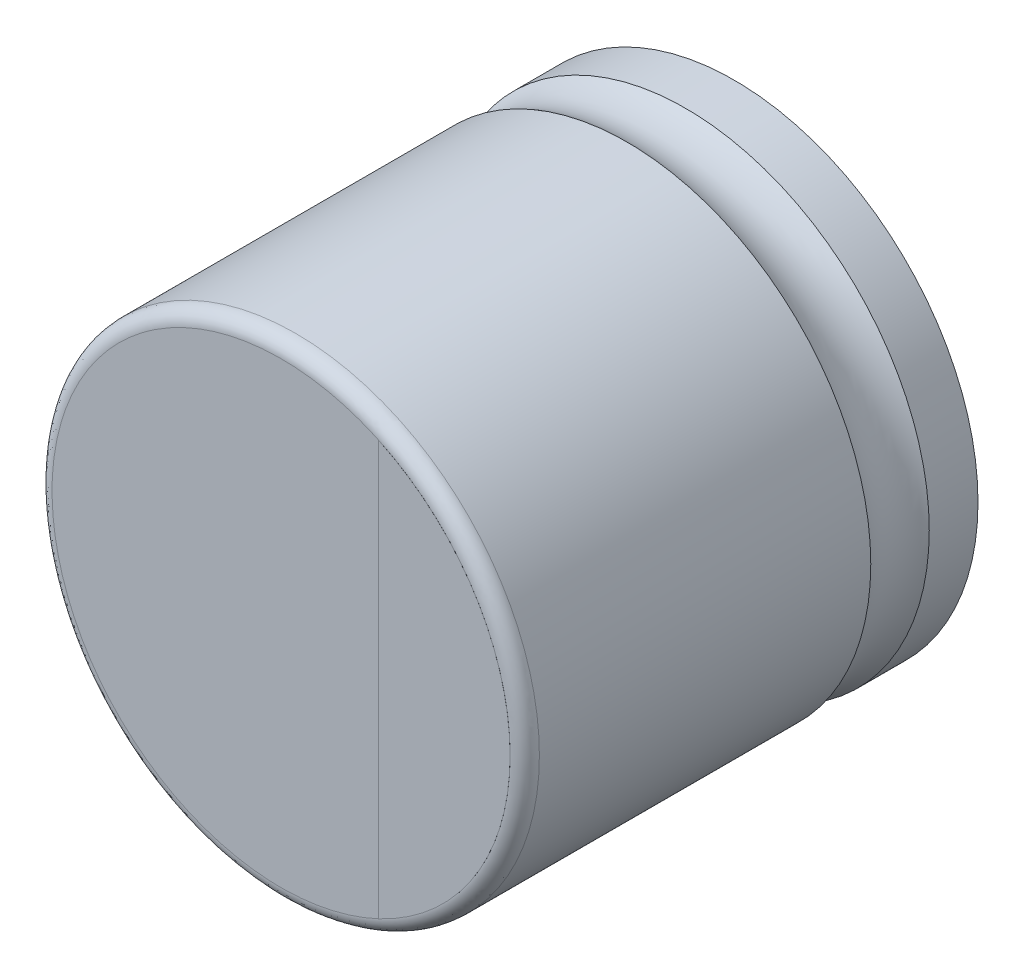
ISO-10303-21;
HEADER;
FILE_DESCRIPTION(('STEP AP214'),'2;1');
FILE_NAME('part.step','',(''),(''),'','','');
FILE_SCHEMA(('AUTOMOTIVE_DESIGN { 1 0 10303 214 1 1 1 1 }'));
ENDSEC;
DATA;
#1=APPLICATION_CONTEXT('core data for automotive mechanical design processes');
#2=APPLICATION_PROTOCOL_DEFINITION('international standard','automotive_design',2000,#1);
#3=PRODUCT_CONTEXT('',#1,'mechanical');
#4=PRODUCT('Part','Part','',(#3));
#5=PRODUCT_RELATED_PRODUCT_CATEGORY('part','',(#4));
#6=PRODUCT_DEFINITION_FORMATION('','',#4);
#7=PRODUCT_DEFINITION_CONTEXT('part definition',#1,'design');
#8=PRODUCT_DEFINITION('design','',#6,#7);
#9=PRODUCT_DEFINITION_SHAPE('','',#8);
#10=(LENGTH_UNIT() NAMED_UNIT(*) SI_UNIT(.MILLI.,.METRE.));
#11=(NAMED_UNIT(*) PLANE_ANGLE_UNIT() SI_UNIT($,.RADIAN.));
#12=(NAMED_UNIT(*) SI_UNIT($,.STERADIAN.) SOLID_ANGLE_UNIT());
#13=UNCERTAINTY_MEASURE_WITH_UNIT(LENGTH_MEASURE(1.E-05),#10,'distance_accuracy_value','');
#14=(GEOMETRIC_REPRESENTATION_CONTEXT(3) GLOBAL_UNCERTAINTY_ASSIGNED_CONTEXT((#13)) GLOBAL_UNIT_ASSIGNED_CONTEXT((#10,
#11,#12)) REPRESENTATION_CONTEXT('',''));
#15=CARTESIAN_POINT('',(0.,0.,0.));
#16=DIRECTION('',(0.,0.,1.));
#17=DIRECTION('',(1.,0.,0.));
#18=AXIS2_PLACEMENT_3D('',#15,#16,#17);
#19=CARTESIAN_POINT('',(0.,0.,5.75));
#20=DIRECTION('',(0.,0.,-1.));
#21=DIRECTION('',(1.,0.,0.));
#22=AXIS2_PLACEMENT_3D('',#19,#20,#21);
#23=CYLINDRICAL_SURFACE('',#22,5.);
#24=CARTESIAN_POINT('',(0.,0.,9.));
#25=DIRECTION('',(0.,0.,-1.));
#26=DIRECTION('',(1.,0.,0.));
#27=AXIS2_PLACEMENT_3D('',#24,#25,#26);
#28=CIRCLE('',#27,5.);
#29=CARTESIAN_POINT('',(5.,1.01865282226E-13,9.));
#30=VERTEX_POINT('',#29);
#31=CARTESIAN_POINT('',(2.127659574468,4.524717088965,9.));
#32=VERTEX_POINT('',#31);
#33=EDGE_CURVE('E30',#30,#32,#28,.T.);
#34=ORIENTED_EDGE('',*,*,#33,.T.);
#35=CARTESIAN_POINT('',(0.,0.,9.));
#36=DIRECTION('',(0.,0.,-1.));
#37=DIRECTION('',(1.,0.,0.));
#38=AXIS2_PLACEMENT_3D('',#35,#36,#37);
#39=CIRCLE('',#38,5.);
#40=EDGE_CURVE('E119',#32,#30,#39,.T.);
#41=ORIENTED_EDGE('',*,*,#40,.T.);
#42=CARTESIAN_POINT('',(5.,1.012529588265E-13,9.));
#43=CARTESIAN_POINT('',(5.,0.,2.2));
#44=(BOUNDED_CURVE() B_SPLINE_CURVE(1,(#42,#43),.UNSPECIFIED.,.F.,
.F.) B_SPLINE_CURVE_WITH_KNOTS((2,2),(-3.25,3.55),
.UNSPECIFIED.) CURVE() GEOMETRIC_REPRESENTATION_ITEM() RATIONAL_B_SPLINE_CURVE((1.,1.)) REPRESENTATION_ITEM(''));
#45=CARTESIAN_POINT('',(5.,0.,2.2));
#46=VERTEX_POINT('',#45);
#47=EDGE_CURVE('E11',#30,#46,#44,.T.);
#48=ORIENTED_EDGE('',*,*,#47,.T.);
#49=CARTESIAN_POINT('',(0.,0.,2.2));
#50=DIRECTION('',(0.,0.,1.));
#51=DIRECTION('',(1.,0.,0.));
#52=AXIS2_PLACEMENT_3D('',#49,#50,#51);
#53=CIRCLE('',#52,5.);
#54=EDGE_CURVE('E117',#46,#46,#53,.T.);
#55=ORIENTED_EDGE('',*,*,#54,.T.);
#56=ORIENTED_EDGE('',*,*,#47,.F.);
#57=EDGE_LOOP('',(#34,#41,#48,#55,#56));
#58=FACE_BOUND('',#57,.T.);
#59=ADVANCED_FACE('F17',(#58),#23,.T.);
#60=CARTESIAN_POINT('',(0.,5.,9.));
#61=CARTESIAN_POINT('',(0.,5.,9.17713755206305));
#62=CARTESIAN_POINT('',(0.,4.87411788572196,9.30176261236709));
#63=CARTESIAN_POINT('',(0.,4.69698925432352,9.29998489197037));
#64=(BOUNDED_CURVE() B_SPLINE_CURVE(3,(#60,#61,#62,#63),.UNSPECIFIED.,.F.,
.F.) B_SPLINE_CURVE_WITH_KNOTS((4,4),(0.,1.),
.UNSPECIFIED.) CURVE() GEOMETRIC_REPRESENTATION_ITEM() RATIONAL_B_SPLINE_CURVE((1.,
0.802366424105878,0.802366424105878,1.)) REPRESENTATION_ITEM(''));
#65=CARTESIAN_POINT('',(0.,0.,9.));
#66=DIRECTION('',(0.,0.,1.));
#67=AXIS1_PLACEMENT('',#65,#66);
#68=SURFACE_OF_REVOLUTION('',#64,#67);
#69=ORIENTED_EDGE('',*,*,#40,.F.);
#70=CARTESIAN_POINT('',(2.127659574468,4.524717088965,9.));
#71=CARTESIAN_POINT('',(2.127659574468,4.524717088965,9.07853981634));
#72=CARTESIAN_POINT('',(2.117162423061,4.502393667998,9.157072950212));
#73=CARTESIAN_POINT('',(2.096151933997,4.457712404106,9.225957044892));
#74=CARTESIAN_POINT('',(2.066839553281,4.395376196035,9.275331694194));
#75=CARTESIAN_POINT('',(2.033421198442,4.324308153459,9.3));
#76=CARTESIAN_POINT('',(2.,4.253234063627,9.3));
#77=(BOUNDED_CURVE() B_SPLINE_CURVE(6,(#70,#71,#72,#73,#74,#75,#76),.UNSPECIFIED.,.F.,
.F.) B_SPLINE_CURVE_WITH_KNOTS((7,7),(6.28318530718,7.853981633974),
.UNSPECIFIED.) CURVE() GEOMETRIC_REPRESENTATION_ITEM() RATIONAL_B_SPLINE_CURVE((1.,1.,1.,1.,1.,
1.,1.)) REPRESENTATION_ITEM(''));
#78=CARTESIAN_POINT('',(2.,4.253234063627,9.3));
#79=VERTEX_POINT('',#78);
#80=EDGE_CURVE('E116',#32,#79,#77,.T.);
#81=ORIENTED_EDGE('',*,*,#80,.T.);
#82=CARTESIAN_POINT('',(0.,0.,9.3));
#83=DIRECTION('',(0.,0.,-1.));
#84=DIRECTION('',(0.,1.,0.));
#85=AXIS2_PLACEMENT_3D('',#82,#83,#84);
#86=CIRCLE('',#85,4.7);
#87=CARTESIAN_POINT('',(2.,-4.253234063627,9.3));
#88=VERTEX_POINT('',#87);
#89=EDGE_CURVE('E96',#79,#88,#86,.T.);
#90=ORIENTED_EDGE('',*,*,#89,.T.);
#91=CARTESIAN_POINT('',(2.,-4.253234063627,9.3));
#92=CARTESIAN_POINT('',(1.483540679413,-4.496088941991,9.3));
#93=CARTESIAN_POINT('',(0.924461929435,-4.608185124431,9.3));
#94=CARTESIAN_POINT('',(0.333442322475,-4.726685499718,9.3));
#95=CARTESIAN_POINT('',(-0.267335236275,-4.692390848112,9.3));
#96=CARTESIAN_POINT('',(-0.882869155401,-4.657253847736,9.3));
#97=CARTESIAN_POINT('',(-1.4675603441,-4.465004662531,9.3));
#98=CARTESIAN_POINT('',(-2.046641924361,-4.2745999427,9.3));
#99=CARTESIAN_POINT('',(-2.557192633978,-3.94344593379,9.3));
#100=CARTESIAN_POINT('',(-3.046552239102,-3.626036924298,9.3));
#101=CARTESIAN_POINT('',(-3.442866270087,-3.199479933723,9.3));
#102=CARTESIAN_POINT('',(-3.825568682578,-2.787573272351,9.3));
#103=CARTESIAN_POINT('',(-4.09990176102,-2.298000337247,9.3));
#104=CARTESIAN_POINT('',(-4.390255931929,-1.779836270124,9.3));
#105=CARTESIAN_POINT('',(-4.542431008808,-1.206781061426,9.3));
#106=CARTESIAN_POINT('',(-4.700068785513,-0.613154622191,9.3));
#107=CARTESIAN_POINT('',(-4.7,0.,9.3));
#108=CARTESIAN_POINT('',(-4.699931097196,0.614200153243,9.3));
#109=CARTESIAN_POINT('',(-4.542431008808,1.206781061426,9.3));
#110=CARTESIAN_POINT('',(-4.389858927717,1.780820754369,9.3));
#111=CARTESIAN_POINT('',(-4.09990176102,2.298000337247,9.3));
#112=CARTESIAN_POINT('',(-3.824940259527,2.788433032081,9.3));
#113=CARTESIAN_POINT('',(-3.442866270087,3.199479933723,9.3));
#114=CARTESIAN_POINT('',(-3.045753224611,3.626706312531,9.3));
#115=CARTESIAN_POINT('',(-2.557192633978,3.94344593379,9.3));
#116=CARTESIAN_POINT('',(-2.045698631428,4.2750535578,9.3));
#117=CARTESIAN_POINT('',(-1.4675603441,4.465004662531,9.3));
#118=CARTESIAN_POINT('',(-0.881829047978,4.657450499821,9.3));
#119=CARTESIAN_POINT('',(-0.267335236275,4.692390848112,9.3));
#120=CARTESIAN_POINT('',(0.33447467734,4.726609985207,9.3));
#121=CARTESIAN_POINT('',(0.924461929435,4.608185124431,9.3));
#122=CARTESIAN_POINT('',(1.484002956958,4.495871565031,9.3));
#123=CARTESIAN_POINT('',(2.,4.253234063627,9.3));
#124=(BOUNDED_CURVE() B_SPLINE_CURVE(2,(#91,#92,#93,#94,#95,#96,#97,#98,#99,#100,#101,#102,#103,
#104,#105,#106,#107,#108,#109,#110,#111,#112,#113,#114,#115,#116,#117,#118,#119,#120,#121,#122,
#123),.UNSPECIFIED.,.F.,.F.) B_SPLINE_CURVE_WITH_KNOTS((3,2,2,2,2,2,2,2,2,2,2,2,2,2,2,2,3),(0.,
0.0625,0.125,0.1875,0.25,0.3125,0.375,0.4375,0.5,0.5625,0.625,0.6875,0.75,0.8125,0.875,0.9375,
1.),.UNSPECIFIED.) CURVE() GEOMETRIC_REPRESENTATION_ITEM() RATIONAL_B_SPLINE_CURVE((1.,1.,1.,1.,
1.,1.,1.,1.,1.,1.,1.,1.,1.,1.,1.,1.,1.,1.,1.,1.,1.,1.,1.,1.,1.,1.,1.,1.,1.,1.,1.,1.,1.)) REPRESENTATION_ITEM(''));
#125=EDGE_CURVE('E76',#88,#79,#124,.T.);
#126=ORIENTED_EDGE('',*,*,#125,.T.);
#127=ORIENTED_EDGE('',*,*,#80,.F.);
#128=ORIENTED_EDGE('',*,*,#33,.F.);
#129=EDGE_LOOP('',(#69,#81,#90,#126,#127,#128));
#130=FACE_BOUND('',#129,.T.);
#131=ADVANCED_FACE('F131',(#130),#68,.T.);
#132=CARTESIAN_POINT('',(0.,5.,2.19999999999995));
#133=CARTESIAN_POINT('',(0.,4.75985705777246,1.82334723049433));
#134=CARTESIAN_POINT('',(0.,4.75985705777246,1.37665276950564));
#135=CARTESIAN_POINT('',(0.,5.00000000000007,1.00000000000002));
#136=(BOUNDED_CURVE() B_SPLINE_CURVE(3,(#132,#133,#134,#135),.UNSPECIFIED.,.F.,
.F.) B_SPLINE_CURVE_WITH_KNOTS((4,4),(0.,1.),
.UNSPECIFIED.) CURVE() GEOMETRIC_REPRESENTATION_ITEM() RATIONAL_B_SPLINE_CURVE((1.,
0.895466666666591,0.895466666666591,1.)) REPRESENTATION_ITEM(''));
#137=CARTESIAN_POINT('',(0.,0.,1.6));
#138=DIRECTION('',(0.,0.,1.));
#139=AXIS1_PLACEMENT('',#137,#138);
#140=SURFACE_OF_REVOLUTION('',#136,#139);
#141=CARTESIAN_POINT('',(0.,0.,1.));
#142=DIRECTION('',(0.,0.,-1.));
#143=DIRECTION('',(0.,1.,0.));
#144=AXIS2_PLACEMENT_3D('',#141,#142,#143);
#145=CIRCLE('',#144,5.);
#146=CARTESIAN_POINT('',(5.,0.,1.));
#147=VERTEX_POINT('',#146);
#148=EDGE_CURVE('E88',#147,#147,#145,.T.);
#149=ORIENTED_EDGE('',*,*,#148,.F.);
#150=CARTESIAN_POINT('',(5.,0.,2.2));
#151=CARTESIAN_POINT('',(4.86377882758,0.,1.986343577782));
#152=CARTESIAN_POINT('',(4.78811802855,0.,1.734033487833));
#153=CARTESIAN_POINT('',(4.78811802855,0.,1.465966512167));
#154=CARTESIAN_POINT('',(4.86377882758,0.,1.213656422218));
#155=CARTESIAN_POINT('',(5.,0.,1.));
#156=(BOUNDED_CURVE() B_SPLINE_CURVE(5,(#150,#151,#152,#153,#154,#155),.UNSPECIFIED.,.F.,
.F.) B_SPLINE_CURVE_WITH_KNOTS((6,6),(2.574004435173,3.709180872006),
.UNSPECIFIED.) CURVE() GEOMETRIC_REPRESENTATION_ITEM() RATIONAL_B_SPLINE_CURVE((1.,1.,1.,1.,1.,1.)) REPRESENTATION_ITEM(''));
#157=EDGE_CURVE('E67',#46,#147,#156,.T.);
#158=ORIENTED_EDGE('',*,*,#157,.F.);
#159=ORIENTED_EDGE('',*,*,#54,.F.);
#160=ORIENTED_EDGE('',*,*,#157,.T.);
#161=EDGE_LOOP('',(#149,#158,#159,#160));
#162=FACE_BOUND('',#161,.T.);
#163=ADVANCED_FACE('F19',(#162),#140,.F.);
#164=CARTESIAN_POINT('',(5.,1.023004032281E-13,9.3));
#165=DIRECTION('',(0.,0.,1.));
#166=DIRECTION('',(0.,-1.,0.));
#167=AXIS2_PLACEMENT_3D('',#164,#165,#166);
#168=PLANE('',#167);
#169=DIRECTION('',(0.,1.,0.));
#170=VECTOR('',#169,1.);
#171=CARTESIAN_POINT('',(2.,0.,9.3));
#172=LINE('',#171,#170);
#173=EDGE_CURVE('E100',#88,#79,#172,.T.);
#174=ORIENTED_EDGE('',*,*,#173,.T.);
#175=ORIENTED_EDGE('',*,*,#125,.F.);
#176=EDGE_LOOP('',(#174,#175));
#177=FACE_BOUND('',#176,.T.);
#178=ADVANCED_FACE('F135',(#177),#168,.T.);
#179=CARTESIAN_POINT('',(0.,0.,9.3));
#180=DIRECTION('',(0.,0.,1.));
#181=DIRECTION('',(0.,-1.,0.));
#182=AXIS2_PLACEMENT_3D('',#179,#180,#181);
#183=CYLINDRICAL_SURFACE('',#182,4.7);
#184=CARTESIAN_POINT('',(0.,0.,9.301));
#185=DIRECTION('',(0.,0.,-1.));
#186=DIRECTION('',(0.,-1.,0.));
#187=AXIS2_PLACEMENT_3D('',#184,#185,#186);
#188=CIRCLE('',#187,4.7);
#189=CARTESIAN_POINT('',(2.,4.253234063627,9.301));
#190=VERTEX_POINT('',#189);
#191=CARTESIAN_POINT('',(2.,-4.253234063627,9.301));
#192=VERTEX_POINT('',#191);
#193=EDGE_CURVE('E174',#190,#192,#188,.T.);
#194=ORIENTED_EDGE('',*,*,#193,.T.);
#195=DIRECTION('',(0.,0.,-1.));
#196=VECTOR('',#195,1.);
#197=CARTESIAN_POINT('',(2.,-4.253234063627,9.3));
#198=LINE('',#197,#196);
#199=EDGE_CURVE('E90',#192,#88,#198,.T.);
#200=ORIENTED_EDGE('',*,*,#199,.T.);
#201=ORIENTED_EDGE('',*,*,#89,.F.);
#202=DIRECTION('',(0.,0.,1.));
#203=VECTOR('',#202,1.);
#204=CARTESIAN_POINT('',(2.,4.253234063627,9.3));
#205=LINE('',#204,#203);
#206=EDGE_CURVE('E177',#79,#190,#205,.T.);
#207=ORIENTED_EDGE('',*,*,#206,.T.);
#208=EDGE_LOOP('',(#194,#200,#201,#207));
#209=FACE_BOUND('',#208,.T.);
#210=ADVANCED_FACE('F138',(#209),#183,.T.);
#211=CARTESIAN_POINT('',(0.,0.,0.5));
#212=DIRECTION('',(0.,0.,-1.));
#213=DIRECTION('',(1.,0.,0.));
#214=AXIS2_PLACEMENT_3D('',#211,#212,#213);
#215=CYLINDRICAL_SURFACE('',#214,5.);
#216=CARTESIAN_POINT('',(0.,0.,0.));
#217=DIRECTION('',(0.,0.,1.));
#218=DIRECTION('',(1.,0.,0.));
#219=AXIS2_PLACEMENT_3D('',#216,#217,#218);
#220=CIRCLE('',#219,5.);
#221=CARTESIAN_POINT('',(5.,0.,0.));
#222=VERTEX_POINT('',#221);
#223=EDGE_CURVE('E87',#222,#222,#220,.T.);
#224=ORIENTED_EDGE('',*,*,#223,.T.);
#225=CARTESIAN_POINT('',(5.,0.,1.));
#226=CARTESIAN_POINT('',(5.,0.,0.));
#227=(BOUNDED_CURVE() B_SPLINE_CURVE(1,(#225,#226),.UNSPECIFIED.,.F.,
.F.) B_SPLINE_CURVE_WITH_KNOTS((2,2),(-0.5,0.5),
.UNSPECIFIED.) CURVE() GEOMETRIC_REPRESENTATION_ITEM() RATIONAL_B_SPLINE_CURVE((1.,1.)) REPRESENTATION_ITEM(''));
#228=EDGE_CURVE('E84',#147,#222,#227,.T.);
#229=ORIENTED_EDGE('',*,*,#228,.F.);
#230=ORIENTED_EDGE('',*,*,#148,.T.);
#231=ORIENTED_EDGE('',*,*,#228,.T.);
#232=EDGE_LOOP('',(#224,#229,#230,#231));
#233=FACE_BOUND('',#232,.T.);
#234=ADVANCED_FACE('F85',(#233),#215,.T.);
#235=CARTESIAN_POINT('',(2.,4.253234063627,9.3));
#236=DIRECTION('',(-1.,0.,0.));
#237=DIRECTION('',(0.,1.,0.));
#238=AXIS2_PLACEMENT_3D('',#235,#236,#237);
#239=PLANE('',#238);
#240=DIRECTION('',(0.,1.,0.));
#241=VECTOR('',#240,1.);
#242=CARTESIAN_POINT('',(2.,4.253234063627,9.301));
#243=LINE('',#242,#241);
#244=EDGE_CURVE('E113',#192,#190,#243,.T.);
#245=ORIENTED_EDGE('',*,*,#244,.T.);
#246=ORIENTED_EDGE('',*,*,#206,.F.);
#247=ORIENTED_EDGE('',*,*,#173,.F.);
#248=ORIENTED_EDGE('',*,*,#199,.F.);
#249=EDGE_LOOP('',(#245,#246,#247,#248));
#250=FACE_BOUND('',#249,.T.);
#251=ADVANCED_FACE('F146',(#250),#239,.T.);
#252=CARTESIAN_POINT('',(2.851530868032,0.,9.301));
#253=DIRECTION('',(0.,0.,1.));
#254=DIRECTION('',(0.,-1.,0.));
#255=AXIS2_PLACEMENT_3D('',#252,#253,#254);
#256=PLANE('',#255);
#257=ORIENTED_EDGE('',*,*,#244,.F.);
#258=ORIENTED_EDGE('',*,*,#193,.F.);
#259=EDGE_LOOP('',(#257,#258));
#260=FACE_BOUND('',#259,.T.);
#261=ADVANCED_FACE('F142',(#260),#256,.T.);
#262=CARTESIAN_POINT('',(0.,0.,0.));
#263=DIRECTION('',(0.,0.,-1.));
#264=DIRECTION('',(0.,-1.,0.));
#265=AXIS2_PLACEMENT_3D('',#262,#263,#264);
#266=PLANE('',#265);
#267=ORIENTED_EDGE('',*,*,#223,.F.);
#268=EDGE_LOOP('',(#267));
#269=FACE_BOUND('',#268,.T.);
#270=ADVANCED_FACE('F139',(#269),#266,.T.);
#271=CLOSED_SHELL('',(#59,#131,#163,#178,#210,#234,#251,#261,#270));
#272=MANIFOLD_SOLID_BREP('B1',#271);
#273=ADVANCED_BREP_SHAPE_REPRESENTATION('',(#18,#272),#14);
#274=SHAPE_DEFINITION_REPRESENTATION(#9,#273);
ENDSEC;
END-ISO-10303-21;
